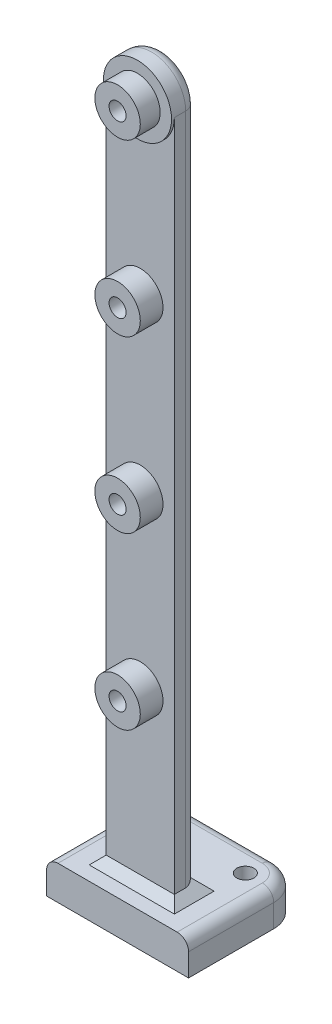
ISO-10303-21;
HEADER;
FILE_DESCRIPTION(('STEP AP214'),'2;1');
FILE_NAME('part.step','',(''),(''),'','','');
FILE_SCHEMA(('AUTOMOTIVE_DESIGN { 1 0 10303 214 1 1 1 1 }'));
ENDSEC;
DATA;
#1=APPLICATION_CONTEXT('core data for automotive mechanical design processes');
#2=APPLICATION_PROTOCOL_DEFINITION('international standard','automotive_design',2000,#1);
#3=PRODUCT_CONTEXT('',#1,'mechanical');
#4=PRODUCT('Part','Part','',(#3));
#5=PRODUCT_RELATED_PRODUCT_CATEGORY('part','',(#4));
#6=PRODUCT_DEFINITION_FORMATION('','',#4);
#7=PRODUCT_DEFINITION_CONTEXT('part definition',#1,'design');
#8=PRODUCT_DEFINITION('design','',#6,#7);
#9=PRODUCT_DEFINITION_SHAPE('','',#8);
#10=(LENGTH_UNIT() NAMED_UNIT(*) SI_UNIT(.MILLI.,.METRE.));
#11=(NAMED_UNIT(*) PLANE_ANGLE_UNIT() SI_UNIT($,.RADIAN.));
#12=(NAMED_UNIT(*) SI_UNIT($,.STERADIAN.) SOLID_ANGLE_UNIT());
#13=UNCERTAINTY_MEASURE_WITH_UNIT(LENGTH_MEASURE(1.E-05),#10,'distance_accuracy_value','');
#14=(GEOMETRIC_REPRESENTATION_CONTEXT(3) GLOBAL_UNCERTAINTY_ASSIGNED_CONTEXT((#13)) GLOBAL_UNIT_ASSIGNED_CONTEXT((#10,
#11,#12)) REPRESENTATION_CONTEXT('',''));
#15=CARTESIAN_POINT('',(0.,0.,0.));
#16=DIRECTION('',(0.,0.,1.));
#17=DIRECTION('',(1.,0.,0.));
#18=AXIS2_PLACEMENT_3D('',#15,#16,#17);
#19=CARTESIAN_POINT('',(0.,0.,4.));
#20=DIRECTION('',(0.,0.,1.));
#21=DIRECTION('',(1.,0.,0.));
#22=AXIS2_PLACEMENT_3D('',#19,#20,#21);
#23=PLANE('',#22);
#24=DIRECTION('',(0.,-1.,0.));
#25=VECTOR('',#24,1.);
#26=CARTESIAN_POINT('',(-5.99999999999999,0.,4.));
#27=LINE('',#26,#25);
#28=CARTESIAN_POINT('',(-6.00000000000001,60.,4.));
#29=VERTEX_POINT('',#28);
#30=CARTESIAN_POINT('',(-5.99999999999997,-58.5,4.));
#31=VERTEX_POINT('',#30);
#32=EDGE_CURVE('E294',#29,#31,#27,.T.);
#33=ORIENTED_EDGE('',*,*,#32,.T.);
#34=DIRECTION('',(1.,0.,0.));
#35=VECTOR('',#34,1.);
#36=CARTESIAN_POINT('',(5.99999999999999,-58.5,4.));
#37=LINE('',#36,#35);
#38=CARTESIAN_POINT('',(5.99999999999999,-58.5,4.));
#39=VERTEX_POINT('',#38);
#40=EDGE_CURVE('E322',#31,#39,#37,.T.);
#41=ORIENTED_EDGE('',*,*,#40,.T.);
#42=DIRECTION('',(0.,-1.,0.));
#43=VECTOR('',#42,1.);
#44=CARTESIAN_POINT('',(5.99999999999998,0.,4.));
#45=LINE('',#44,#43);
#46=CARTESIAN_POINT('',(5.99999999999996,60.,4.));
#47=VERTEX_POINT('',#46);
#48=EDGE_CURVE('E297',#47,#39,#45,.T.);
#49=ORIENTED_EDGE('',*,*,#48,.F.);
#50=CARTESIAN_POINT('',(0.,60.,4.));
#51=DIRECTION('',(0.,0.,1.));
#52=DIRECTION('',(1.,0.,0.));
#53=AXIS2_PLACEMENT_3D('',#50,#51,#52);
#54=CIRCLE('',#53,5.99999999999998);
#55=EDGE_CURVE('E248',#47,#29,#54,.F.);
#56=ORIENTED_EDGE('',*,*,#55,.T.);
#57=EDGE_LOOP('',(#33,#41,#49,#56));
#58=FACE_BOUND('',#57,.T.);
#59=CARTESIAN_POINT('',(0.,30.,4.));
#60=DIRECTION('',(0.,0.,1.));
#61=DIRECTION('',(1.,0.,0.));
#62=AXIS2_PLACEMENT_3D('',#59,#60,#61);
#63=CIRCLE('',#62,4.);
#64=CARTESIAN_POINT('',(4.,30.,4.));
#65=VERTEX_POINT('',#64);
#66=EDGE_CURVE('E285',#65,#65,#63,.T.);
#67=ORIENTED_EDGE('',*,*,#66,.F.);
#68=EDGE_LOOP('',(#67));
#69=FACE_BOUND('',#68,.T.);
#70=CARTESIAN_POINT('',(0.,0.,4.));
#71=DIRECTION('',(0.,0.,1.));
#72=DIRECTION('',(1.,0.,0.));
#73=AXIS2_PLACEMENT_3D('',#70,#71,#72);
#74=CIRCLE('',#73,4.);
#75=CARTESIAN_POINT('',(3.99999999999999,0.,4.));
#76=VERTEX_POINT('',#75);
#77=EDGE_CURVE('E288',#76,#76,#74,.T.);
#78=ORIENTED_EDGE('',*,*,#77,.F.);
#79=EDGE_LOOP('',(#78));
#80=FACE_BOUND('',#79,.T.);
#81=CARTESIAN_POINT('',(0.,-30.,4.));
#82=DIRECTION('',(0.,0.,1.));
#83=DIRECTION('',(1.,0.,0.));
#84=AXIS2_PLACEMENT_3D('',#81,#82,#83);
#85=CIRCLE('',#84,4.);
#86=CARTESIAN_POINT('',(4.00000000000001,-30.,4.));
#87=VERTEX_POINT('',#86);
#88=EDGE_CURVE('E291',#87,#87,#85,.T.);
#89=ORIENTED_EDGE('',*,*,#88,.F.);
#90=EDGE_LOOP('',(#89));
#91=FACE_BOUND('',#90,.T.);
#92=ADVANCED_FACE('F81',(#58,#69,#80,#91),#23,.T.);
#93=CARTESIAN_POINT('',(-5.99999999999999,0.,4.));
#94=DIRECTION('',(1.,0.,0.));
#95=DIRECTION('',(0.,1.,0.));
#96=AXIS2_PLACEMENT_3D('',#93,#94,#95);
#97=PLANE('',#96);
#98=DIRECTION('',(0.,0.,-1.));
#99=VECTOR('',#98,1.);
#100=CARTESIAN_POINT('',(-6.00000000000001,60.,4.));
#101=LINE('',#100,#99);
#102=CARTESIAN_POINT('',(-6.00000000000001,60.,2.));
#103=VERTEX_POINT('',#102);
#104=EDGE_CURVE('E303',#29,#103,#101,.T.);
#105=ORIENTED_EDGE('',*,*,#104,.T.);
#106=DIRECTION('',(0.,-1.,0.));
#107=VECTOR('',#106,1.);
#108=CARTESIAN_POINT('',(-5.99999999999999,0.,2.));
#109=LINE('',#108,#107);
#110=CARTESIAN_POINT('',(-5.99999999999997,-58.5,2.));
#111=VERTEX_POINT('',#110);
#112=EDGE_CURVE('E327',#103,#111,#109,.T.);
#113=ORIENTED_EDGE('',*,*,#112,.T.);
#114=DIRECTION('',(0.,0.,1.));
#115=VECTOR('',#114,1.);
#116=CARTESIAN_POINT('',(-5.99999999999997,-58.5,4.));
#117=LINE('',#116,#115);
#118=EDGE_CURVE('E320',#111,#31,#117,.T.);
#119=ORIENTED_EDGE('',*,*,#118,.T.);
#120=ORIENTED_EDGE('',*,*,#32,.F.);
#121=EDGE_LOOP('',(#105,#113,#119,#120));
#122=FACE_BOUND('',#121,.T.);
#123=ADVANCED_FACE('F460',(#122),#97,.F.);
#124=CARTESIAN_POINT('',(5.99999999999998,0.,4.));
#125=DIRECTION('',(1.,0.,0.));
#126=DIRECTION('',(0.,1.,0.));
#127=AXIS2_PLACEMENT_3D('',#124,#125,#126);
#128=PLANE('',#127);
#129=DIRECTION('',(0.,0.,-1.));
#130=VECTOR('',#129,1.);
#131=CARTESIAN_POINT('',(5.99999999999999,-58.5,0.));
#132=LINE('',#131,#130);
#133=CARTESIAN_POINT('',(5.99999999999999,-58.5,2.));
#134=VERTEX_POINT('',#133);
#135=EDGE_CURVE('E324',#39,#134,#132,.T.);
#136=ORIENTED_EDGE('',*,*,#135,.T.);
#137=DIRECTION('',(0.,-1.,0.));
#138=VECTOR('',#137,1.);
#139=CARTESIAN_POINT('',(5.99999999999996,60.,2.));
#140=LINE('',#139,#138);
#141=CARTESIAN_POINT('',(5.99999999999996,60.,2.));
#142=VERTEX_POINT('',#141);
#143=EDGE_CURVE('E348',#134,#142,#140,.F.);
#144=ORIENTED_EDGE('',*,*,#143,.T.);
#145=DIRECTION('',(0.,0.,-1.));
#146=VECTOR('',#145,1.);
#147=CARTESIAN_POINT('',(5.99999999999996,60.,4.));
#148=LINE('',#147,#146);
#149=EDGE_CURVE('E300',#47,#142,#148,.T.);
#150=ORIENTED_EDGE('',*,*,#149,.F.);
#151=ORIENTED_EDGE('',*,*,#48,.T.);
#152=EDGE_LOOP('',(#136,#144,#150,#151));
#153=FACE_BOUND('',#152,.T.);
#154=ADVANCED_FACE('F468',(#153),#128,.T.);
#155=CARTESIAN_POINT('',(0.,0.,0.));
#156=DIRECTION('',(0.,0.,1.));
#157=DIRECTION('',(1.,0.,0.));
#158=AXIS2_PLACEMENT_3D('',#155,#156,#157);
#159=PLANE('',#158);
#160=DIRECTION('',(-1.,0.,0.));
#161=VECTOR('',#160,1.);
#162=CARTESIAN_POINT('',(0.,-58.5,0.));
#163=LINE('',#162,#161);
#164=CARTESIAN_POINT('',(3.99999999999999,-58.5,0.));
#165=VERTEX_POINT('',#164);
#166=CARTESIAN_POINT('',(-3.99999999999997,-58.5,0.));
#167=VERTEX_POINT('',#166);
#168=EDGE_CURVE('E306',#165,#167,#163,.T.);
#169=ORIENTED_EDGE('',*,*,#168,.T.);
#170=DIRECTION('',(0.,-1.,0.));
#171=VECTOR('',#170,1.);
#172=CARTESIAN_POINT('',(-3.99999999999999,0.,0.));
#173=LINE('',#172,#171);
#174=CARTESIAN_POINT('',(-4.00000000000001,60.,0.));
#175=VERTEX_POINT('',#174);
#176=EDGE_CURVE('E344',#167,#175,#173,.F.);
#177=ORIENTED_EDGE('',*,*,#176,.T.);
#178=CARTESIAN_POINT('',(0.,60.,0.));
#179=DIRECTION('',(0.,0.,1.));
#180=DIRECTION('',(1.,0.,0.));
#181=AXIS2_PLACEMENT_3D('',#178,#179,#180);
#182=CIRCLE('',#181,3.99999999999998);
#183=CARTESIAN_POINT('',(3.99999999999996,60.,0.));
#184=VERTEX_POINT('',#183);
#185=EDGE_CURVE('E342',#175,#184,#182,.F.);
#186=ORIENTED_EDGE('',*,*,#185,.T.);
#187=DIRECTION('',(0.,-1.,0.));
#188=VECTOR('',#187,1.);
#189=CARTESIAN_POINT('',(3.99999999999999,-58.5,0.));
#190=LINE('',#189,#188);
#191=EDGE_CURVE('E340',#184,#165,#190,.T.);
#192=ORIENTED_EDGE('',*,*,#191,.T.);
#193=EDGE_LOOP('',(#169,#177,#186,#192));
#194=FACE_BOUND('',#193,.T.);
#195=CARTESIAN_POINT('',(0.,30.,0.));
#196=DIRECTION('',(0.,0.,1.));
#197=DIRECTION('',(1.,0.,0.));
#198=AXIS2_PLACEMENT_3D('',#195,#196,#197);
#199=CIRCLE('',#198,1.5);
#200=CARTESIAN_POINT('',(1.5,30.,0.));
#201=VERTEX_POINT('',#200);
#202=EDGE_CURVE('E259',#201,#201,#199,.T.);
#203=ORIENTED_EDGE('',*,*,#202,.T.);
#204=EDGE_LOOP('',(#203));
#205=FACE_BOUND('',#204,.T.);
#206=CARTESIAN_POINT('',(0.,0.,0.));
#207=DIRECTION('',(0.,0.,1.));
#208=DIRECTION('',(1.,0.,0.));
#209=AXIS2_PLACEMENT_3D('',#206,#207,#208);
#210=CIRCLE('',#209,1.5);
#211=CARTESIAN_POINT('',(1.49999999999999,0.,0.));
#212=VERTEX_POINT('',#211);
#213=EDGE_CURVE('E263',#212,#212,#210,.T.);
#214=ORIENTED_EDGE('',*,*,#213,.T.);
#215=EDGE_LOOP('',(#214));
#216=FACE_BOUND('',#215,.T.);
#217=CARTESIAN_POINT('',(0.,-30.,0.));
#218=DIRECTION('',(0.,0.,1.));
#219=DIRECTION('',(1.,0.,0.));
#220=AXIS2_PLACEMENT_3D('',#217,#218,#219);
#221=CIRCLE('',#220,1.5);
#222=CARTESIAN_POINT('',(1.50000000000001,-30.,0.));
#223=VERTEX_POINT('',#222);
#224=EDGE_CURVE('E251',#223,#223,#221,.T.);
#225=ORIENTED_EDGE('',*,*,#224,.T.);
#226=EDGE_LOOP('',(#225));
#227=FACE_BOUND('',#226,.T.);
#228=CARTESIAN_POINT('',(0.,60.,0.));
#229=DIRECTION('',(0.,0.,1.));
#230=DIRECTION('',(1.,0.,0.));
#231=AXIS2_PLACEMENT_3D('',#228,#229,#230);
#232=CIRCLE('',#231,1.5);
#233=CARTESIAN_POINT('',(1.49999999999998,60.,0.));
#234=VERTEX_POINT('',#233);
#235=EDGE_CURVE('E282',#234,#234,#232,.T.);
#236=ORIENTED_EDGE('',*,*,#235,.T.);
#237=EDGE_LOOP('',(#236));
#238=FACE_BOUND('',#237,.T.);
#239=ADVANCED_FACE('F476',(#194,#205,#216,#227,#238),#159,.F.);
#240=CARTESIAN_POINT('',(0.,60.,4.));
#241=DIRECTION('',(0.,0.,-1.));
#242=DIRECTION('',(-1.,0.,0.));
#243=AXIS2_PLACEMENT_3D('',#240,#241,#242);
#244=CYLINDRICAL_SURFACE('',#243,1.5);
#245=ORIENTED_EDGE('',*,*,#235,.F.);
#246=EDGE_LOOP('',(#245));
#247=FACE_BOUND('',#246,.T.);
#248=CARTESIAN_POINT('',(0.,60.,8.));
#249=DIRECTION('',(0.,0.,1.));
#250=DIRECTION('',(1.,0.,0.));
#251=AXIS2_PLACEMENT_3D('',#248,#249,#250);
#252=CIRCLE('',#251,1.5);
#253=CARTESIAN_POINT('',(1.49999999999998,60.,8.));
#254=VERTEX_POINT('',#253);
#255=EDGE_CURVE('E255',#254,#254,#252,.T.);
#256=ORIENTED_EDGE('',*,*,#255,.T.);
#257=EDGE_LOOP('',(#256));
#258=FACE_BOUND('',#257,.T.);
#259=ADVANCED_FACE('F479',(#247,#258),#244,.F.);
#260=CARTESIAN_POINT('',(0.,60.,4.));
#261=DIRECTION('',(0.,0.,-1.));
#262=DIRECTION('',(-1.,0.,0.));
#263=AXIS2_PLACEMENT_3D('',#260,#261,#262);
#264=CYLINDRICAL_SURFACE('',#263,5.99999999999998);
#265=ORIENTED_EDGE('',*,*,#149,.T.);
#266=CARTESIAN_POINT('',(0.,60.,2.));
#267=DIRECTION('',(0.,0.,1.));
#268=DIRECTION('',(1.,0.,0.));
#269=AXIS2_PLACEMENT_3D('',#266,#267,#268);
#270=CIRCLE('',#269,5.99999999999998);
#271=EDGE_CURVE('E346',#142,#103,#270,.T.);
#272=ORIENTED_EDGE('',*,*,#271,.T.);
#273=ORIENTED_EDGE('',*,*,#104,.F.);
#274=ORIENTED_EDGE('',*,*,#55,.F.);
#275=EDGE_LOOP('',(#265,#272,#273,#274));
#276=FACE_BOUND('',#275,.T.);
#277=CARTESIAN_POINT('',(0.,60.,4.5));
#278=DIRECTION('',(0.,0.,1.));
#279=DIRECTION('',(1.,0.,0.));
#280=AXIS2_PLACEMENT_3D('',#277,#278,#279);
#281=CIRCLE('',#280,5.99999999999998);
#282=CARTESIAN_POINT('',(5.99999999999996,60.,4.5));
#283=VERTEX_POINT('',#282);
#284=EDGE_CURVE('E241',#283,#283,#281,.T.);
#285=ORIENTED_EDGE('',*,*,#284,.F.);
#286=EDGE_LOOP('',(#285));
#287=FACE_BOUND('',#286,.T.);
#288=ADVANCED_FACE('F481',(#276,#287),#264,.T.);
#289=CARTESIAN_POINT('',(0.,30.,8.));
#290=DIRECTION('',(0.,0.,-1.));
#291=DIRECTION('',(-1.,0.,0.));
#292=AXIS2_PLACEMENT_3D('',#289,#290,#291);
#293=CYLINDRICAL_SURFACE('',#292,1.5);
#294=CARTESIAN_POINT('',(0.,30.,8.));
#295=DIRECTION('',(0.,0.,1.));
#296=DIRECTION('',(1.,0.,0.));
#297=AXIS2_PLACEMENT_3D('',#294,#295,#296);
#298=CIRCLE('',#297,1.5);
#299=CARTESIAN_POINT('',(1.5,30.,8.));
#300=VERTEX_POINT('',#299);
#301=EDGE_CURVE('E276',#300,#300,#298,.T.);
#302=ORIENTED_EDGE('',*,*,#301,.T.);
#303=EDGE_LOOP('',(#302));
#304=FACE_BOUND('',#303,.T.);
#305=ORIENTED_EDGE('',*,*,#202,.F.);
#306=EDGE_LOOP('',(#305));
#307=FACE_BOUND('',#306,.T.);
#308=ADVANCED_FACE('F474',(#304,#307),#293,.F.);
#309=CARTESIAN_POINT('',(0.,30.,8.));
#310=DIRECTION('',(0.,0.,-1.));
#311=DIRECTION('',(-1.,0.,0.));
#312=AXIS2_PLACEMENT_3D('',#309,#310,#311);
#313=CYLINDRICAL_SURFACE('',#312,4.);
#314=ORIENTED_EDGE('',*,*,#66,.T.);
#315=EDGE_LOOP('',(#314));
#316=FACE_BOUND('',#315,.T.);
#317=CARTESIAN_POINT('',(0.,30.,8.));
#318=DIRECTION('',(0.,0.,1.));
#319=DIRECTION('',(1.,0.,0.));
#320=AXIS2_PLACEMENT_3D('',#317,#318,#319);
#321=CIRCLE('',#320,4.);
#322=CARTESIAN_POINT('',(4.,30.,8.));
#323=VERTEX_POINT('',#322);
#324=EDGE_CURVE('E279',#323,#323,#321,.T.);
#325=ORIENTED_EDGE('',*,*,#324,.F.);
#326=EDGE_LOOP('',(#325));
#327=FACE_BOUND('',#326,.T.);
#328=ADVANCED_FACE('F600',(#316,#327),#313,.T.);
#329=CARTESIAN_POINT('',(0.,0.,8.));
#330=DIRECTION('',(0.,0.,1.));
#331=DIRECTION('',(1.,0.,0.));
#332=AXIS2_PLACEMENT_3D('',#329,#330,#331);
#333=PLANE('',#332);
#334=ORIENTED_EDGE('',*,*,#301,.F.);
#335=EDGE_LOOP('',(#334));
#336=FACE_BOUND('',#335,.T.);
#337=ORIENTED_EDGE('',*,*,#324,.T.);
#338=EDGE_LOOP('',(#337));
#339=FACE_BOUND('',#338,.T.);
#340=ADVANCED_FACE('F575',(#336,#339),#333,.T.);
#341=CARTESIAN_POINT('',(0.,60.,8.));
#342=DIRECTION('',(0.,0.,-1.));
#343=DIRECTION('',(-1.,0.,0.));
#344=AXIS2_PLACEMENT_3D('',#341,#342,#343);
#345=CYLINDRICAL_SURFACE('',#344,4.);
#346=CARTESIAN_POINT('',(0.,60.,4.5));
#347=DIRECTION('',(0.,0.,1.));
#348=DIRECTION('',(1.,0.,0.));
#349=AXIS2_PLACEMENT_3D('',#346,#347,#348);
#350=CIRCLE('',#349,4.);
#351=CARTESIAN_POINT('',(3.99999999999998,60.,4.5));
#352=VERTEX_POINT('',#351);
#353=EDGE_CURVE('E245',#352,#352,#350,.T.);
#354=ORIENTED_EDGE('',*,*,#353,.T.);
#355=EDGE_LOOP('',(#354));
#356=FACE_BOUND('',#355,.T.);
#357=CARTESIAN_POINT('',(0.,60.,8.));
#358=DIRECTION('',(0.,0.,1.));
#359=DIRECTION('',(1.,0.,0.));
#360=AXIS2_PLACEMENT_3D('',#357,#358,#359);
#361=CIRCLE('',#360,4.);
#362=CARTESIAN_POINT('',(3.99999999999998,60.,8.));
#363=VERTEX_POINT('',#362);
#364=EDGE_CURVE('E252',#363,#363,#361,.T.);
#365=ORIENTED_EDGE('',*,*,#364,.F.);
#366=EDGE_LOOP('',(#365));
#367=FACE_BOUND('',#366,.T.);
#368=ADVANCED_FACE('F571',(#356,#367),#345,.T.);
#369=CARTESIAN_POINT('',(0.,0.,8.));
#370=DIRECTION('',(0.,0.,1.));
#371=DIRECTION('',(1.,0.,0.));
#372=AXIS2_PLACEMENT_3D('',#369,#370,#371);
#373=PLANE('',#372);
#374=ORIENTED_EDGE('',*,*,#364,.T.);
#375=EDGE_LOOP('',(#374));
#376=FACE_BOUND('',#375,.T.);
#377=ORIENTED_EDGE('',*,*,#255,.F.);
#378=EDGE_LOOP('',(#377));
#379=FACE_BOUND('',#378,.T.);
#380=ADVANCED_FACE('F567',(#376,#379),#373,.T.);
#381=CARTESIAN_POINT('',(0.,0.,8.));
#382=DIRECTION('',(0.,0.,-1.));
#383=DIRECTION('',(-1.,0.,0.));
#384=AXIS2_PLACEMENT_3D('',#381,#382,#383);
#385=CYLINDRICAL_SURFACE('',#384,1.5);
#386=CARTESIAN_POINT('',(0.,0.,8.));
#387=DIRECTION('',(0.,0.,1.));
#388=DIRECTION('',(1.,0.,0.));
#389=AXIS2_PLACEMENT_3D('',#386,#387,#388);
#390=CIRCLE('',#389,1.5);
#391=CARTESIAN_POINT('',(1.49999999999999,0.,8.));
#392=VERTEX_POINT('',#391);
#393=EDGE_CURVE('E260',#392,#392,#390,.T.);
#394=ORIENTED_EDGE('',*,*,#393,.T.);
#395=EDGE_LOOP('',(#394));
#396=FACE_BOUND('',#395,.T.);
#397=ORIENTED_EDGE('',*,*,#213,.F.);
#398=EDGE_LOOP('',(#397));
#399=FACE_BOUND('',#398,.T.);
#400=ADVANCED_FACE('F570',(#396,#399),#385,.F.);
#401=CARTESIAN_POINT('',(0.,0.,8.));
#402=DIRECTION('',(0.,0.,-1.));
#403=DIRECTION('',(-1.,0.,0.));
#404=AXIS2_PLACEMENT_3D('',#401,#402,#403);
#405=CYLINDRICAL_SURFACE('',#404,4.);
#406=ORIENTED_EDGE('',*,*,#77,.T.);
#407=EDGE_LOOP('',(#406));
#408=FACE_BOUND('',#407,.T.);
#409=CARTESIAN_POINT('',(0.,0.,8.));
#410=DIRECTION('',(0.,0.,1.));
#411=DIRECTION('',(1.,0.,0.));
#412=AXIS2_PLACEMENT_3D('',#409,#410,#411);
#413=CIRCLE('',#412,4.);
#414=CARTESIAN_POINT('',(3.99999999999999,0.,8.));
#415=VERTEX_POINT('',#414);
#416=EDGE_CURVE('E256',#415,#415,#413,.T.);
#417=ORIENTED_EDGE('',*,*,#416,.F.);
#418=EDGE_LOOP('',(#417));
#419=FACE_BOUND('',#418,.T.);
#420=ADVANCED_FACE('F581',(#408,#419),#405,.T.);
#421=CARTESIAN_POINT('',(0.,0.,8.));
#422=DIRECTION('',(0.,0.,1.));
#423=DIRECTION('',(1.,0.,0.));
#424=AXIS2_PLACEMENT_3D('',#421,#422,#423);
#425=PLANE('',#424);
#426=ORIENTED_EDGE('',*,*,#393,.F.);
#427=EDGE_LOOP('',(#426));
#428=FACE_BOUND('',#427,.T.);
#429=ORIENTED_EDGE('',*,*,#416,.T.);
#430=EDGE_LOOP('',(#429));
#431=FACE_BOUND('',#430,.T.);
#432=ADVANCED_FACE('F577',(#428,#431),#425,.T.);
#433=CARTESIAN_POINT('',(0.,-30.,8.));
#434=DIRECTION('',(0.,0.,-1.));
#435=DIRECTION('',(-1.,0.,0.));
#436=AXIS2_PLACEMENT_3D('',#433,#434,#435);
#437=CYLINDRICAL_SURFACE('',#436,1.5);
#438=CARTESIAN_POINT('',(0.,-30.,8.));
#439=DIRECTION('',(0.,0.,1.));
#440=DIRECTION('',(1.,0.,0.));
#441=AXIS2_PLACEMENT_3D('',#438,#439,#440);
#442=CIRCLE('',#441,1.5);
#443=CARTESIAN_POINT('',(1.50000000000001,-30.,8.));
#444=VERTEX_POINT('',#443);
#445=EDGE_CURVE('E269',#444,#444,#442,.T.);
#446=ORIENTED_EDGE('',*,*,#445,.T.);
#447=EDGE_LOOP('',(#446));
#448=FACE_BOUND('',#447,.T.);
#449=ORIENTED_EDGE('',*,*,#224,.F.);
#450=EDGE_LOOP('',(#449));
#451=FACE_BOUND('',#450,.T.);
#452=ADVANCED_FACE('F580',(#448,#451),#437,.F.);
#453=CARTESIAN_POINT('',(0.,-30.,8.));
#454=DIRECTION('',(0.,0.,-1.));
#455=DIRECTION('',(-1.,0.,0.));
#456=AXIS2_PLACEMENT_3D('',#453,#454,#455);
#457=CYLINDRICAL_SURFACE('',#456,4.);
#458=ORIENTED_EDGE('',*,*,#88,.T.);
#459=EDGE_LOOP('',(#458));
#460=FACE_BOUND('',#459,.T.);
#461=CARTESIAN_POINT('',(0.,-30.,8.));
#462=DIRECTION('',(0.,0.,1.));
#463=DIRECTION('',(1.,0.,0.));
#464=AXIS2_PLACEMENT_3D('',#461,#462,#463);
#465=CIRCLE('',#464,4.);
#466=CARTESIAN_POINT('',(4.00000000000001,-30.,8.));
#467=VERTEX_POINT('',#466);
#468=EDGE_CURVE('E268',#467,#467,#465,.T.);
#469=ORIENTED_EDGE('',*,*,#468,.F.);
#470=EDGE_LOOP('',(#469));
#471=FACE_BOUND('',#470,.T.);
#472=ADVANCED_FACE('F591',(#460,#471),#457,.T.);
#473=CARTESIAN_POINT('',(0.,0.,8.));
#474=DIRECTION('',(0.,0.,1.));
#475=DIRECTION('',(1.,0.,0.));
#476=AXIS2_PLACEMENT_3D('',#473,#474,#475);
#477=PLANE('',#476);
#478=ORIENTED_EDGE('',*,*,#445,.F.);
#479=EDGE_LOOP('',(#478));
#480=FACE_BOUND('',#479,.T.);
#481=ORIENTED_EDGE('',*,*,#468,.T.);
#482=EDGE_LOOP('',(#481));
#483=FACE_BOUND('',#482,.T.);
#484=ADVANCED_FACE('F565',(#480,#483),#477,.T.);
#485=CARTESIAN_POINT('',(0.,0.,4.5));
#486=DIRECTION('',(0.,0.,1.));
#487=DIRECTION('',(1.,0.,0.));
#488=AXIS2_PLACEMENT_3D('',#485,#486,#487);
#489=PLANE('',#488);
#490=ORIENTED_EDGE('',*,*,#284,.T.);
#491=EDGE_LOOP('',(#490));
#492=FACE_BOUND('',#491,.T.);
#493=ORIENTED_EDGE('',*,*,#353,.F.);
#494=EDGE_LOOP('',(#493));
#495=FACE_BOUND('',#494,.T.);
#496=ADVANCED_FACE('F563',(#492,#495),#489,.T.);
#497=CARTESIAN_POINT('',(-12.5,-60.,-12.));
#498=DIRECTION('',(-1.,0.,0.));
#499=DIRECTION('',(0.,0.,1.));
#500=AXIS2_PLACEMENT_3D('',#497,#498,#499);
#501=PLANE('',#500);
#502=DIRECTION('',(0.,-1.,0.));
#503=VECTOR('',#502,1.);
#504=CARTESIAN_POINT('',(-12.5,-60.,8.));
#505=LINE('',#504,#503);
#506=CARTESIAN_POINT('',(-12.5,-62.,8.));
#507=VERTEX_POINT('',#506);
#508=CARTESIAN_POINT('',(-12.5,-66.,8.));
#509=VERTEX_POINT('',#508);
#510=EDGE_CURVE('E208',#507,#509,#505,.T.);
#511=ORIENTED_EDGE('',*,*,#510,.F.);
#512=DIRECTION('',(0.,0.,1.));
#513=VECTOR('',#512,1.);
#514=CARTESIAN_POINT('',(-12.5,-62.,-12.));
#515=LINE('',#514,#513);
#516=CARTESIAN_POINT('',(-12.5,-62.,-7.));
#517=VERTEX_POINT('',#516);
#518=EDGE_CURVE('E393',#507,#517,#515,.F.);
#519=ORIENTED_EDGE('',*,*,#518,.T.);
#520=DIRECTION('',(0.,-1.,0.));
#521=VECTOR('',#520,1.);
#522=CARTESIAN_POINT('',(-12.5,-66.,-7.));
#523=LINE('',#522,#521);
#524=CARTESIAN_POINT('',(-12.5,-66.,-7.));
#525=VERTEX_POINT('',#524);
#526=EDGE_CURVE('E225',#517,#525,#523,.T.);
#527=ORIENTED_EDGE('',*,*,#526,.T.);
#528=DIRECTION('',(0.,0.,1.));
#529=VECTOR('',#528,1.);
#530=CARTESIAN_POINT('',(-12.5,-66.,-12.));
#531=LINE('',#530,#529);
#532=EDGE_CURVE('E222',#525,#509,#531,.T.);
#533=ORIENTED_EDGE('',*,*,#532,.T.);
#534=EDGE_LOOP('',(#511,#519,#527,#533));
#535=FACE_BOUND('',#534,.T.);
#536=ADVANCED_FACE('F223',(#535),#501,.T.);
#537=CARTESIAN_POINT('',(-12.5,-60.,-12.));
#538=DIRECTION('',(0.,1.,0.));
#539=DIRECTION('',(0.,0.,1.));
#540=AXIS2_PLACEMENT_3D('',#537,#538,#539);
#541=PLANE('',#540);
#542=CARTESIAN_POINT('',(-7.50000000000001,-60.,-7.));
#543=DIRECTION('',(0.,1.,0.));
#544=DIRECTION('',(0.,0.,1.));
#545=AXIS2_PLACEMENT_3D('',#542,#543,#544);
#546=CIRCLE('',#545,1.5);
#547=CARTESIAN_POINT('',(-7.50000000000001,-60.,-5.5));
#548=VERTEX_POINT('',#547);
#549=EDGE_CURVE('E408',#548,#548,#546,.T.);
#550=ORIENTED_EDGE('',*,*,#549,.F.);
#551=EDGE_LOOP('',(#550));
#552=FACE_BOUND('',#551,.T.);
#553=CARTESIAN_POINT('',(7.49999999999999,-60.,-7.));
#554=DIRECTION('',(0.,1.,0.));
#555=DIRECTION('',(0.,0.,1.));
#556=AXIS2_PLACEMENT_3D('',#553,#554,#555);
#557=CIRCLE('',#556,1.5);
#558=CARTESIAN_POINT('',(7.49999999999999,-60.,-5.5));
#559=VERTEX_POINT('',#558);
#560=EDGE_CURVE('E413',#559,#559,#557,.T.);
#561=ORIENTED_EDGE('',*,*,#560,.F.);
#562=EDGE_LOOP('',(#561));
#563=FACE_BOUND('',#562,.T.);
#564=DIRECTION('',(0.,0.,-1.));
#565=VECTOR('',#564,1.);
#566=CARTESIAN_POINT('',(-7.49999999999993,-60.,-12.));
#567=LINE('',#566,#565);
#568=CARTESIAN_POINT('',(-7.49999999999993,-60.,5.49999999999996));
#569=VERTEX_POINT('',#568);
#570=CARTESIAN_POINT('',(-7.49999999999993,-60.,-1.49999999999996));
#571=VERTEX_POINT('',#570);
#572=EDGE_CURVE('E315',#569,#571,#567,.T.);
#573=ORIENTED_EDGE('',*,*,#572,.T.);
#574=DIRECTION('',(1.,0.,0.));
#575=VECTOR('',#574,1.);
#576=CARTESIAN_POINT('',(-12.5,-60.,-1.49999999999996));
#577=LINE('',#576,#575);
#578=CARTESIAN_POINT('',(7.49999999999995,-60.,-1.49999999999996));
#579=VERTEX_POINT('',#578);
#580=EDGE_CURVE('E317',#571,#579,#577,.T.);
#581=ORIENTED_EDGE('',*,*,#580,.T.);
#582=DIRECTION('',(0.,0.,1.));
#583=VECTOR('',#582,1.);
#584=CARTESIAN_POINT('',(7.49999999999995,-60.,4.));
#585=LINE('',#584,#583);
#586=CARTESIAN_POINT('',(7.49999999999995,-60.,5.49999999999996));
#587=VERTEX_POINT('',#586);
#588=EDGE_CURVE('E311',#579,#587,#585,.T.);
#589=ORIENTED_EDGE('',*,*,#588,.T.);
#590=DIRECTION('',(-1.,0.,0.));
#591=VECTOR('',#590,1.);
#592=CARTESIAN_POINT('',(-5.99999999999997,-60.,5.49999999999996));
#593=LINE('',#592,#591);
#594=EDGE_CURVE('E313',#587,#569,#593,.T.);
#595=ORIENTED_EDGE('',*,*,#594,.T.);
#596=EDGE_LOOP('',(#573,#581,#589,#595));
#597=FACE_BOUND('',#596,.T.);
#598=CARTESIAN_POINT('',(-7.50000000000001,-60.,-7.));
#599=DIRECTION('',(0.,1.,0.));
#600=DIRECTION('',(0.,0.,1.));
#601=AXIS2_PLACEMENT_3D('',#598,#599,#600);
#602=CIRCLE('',#601,3.);
#603=CARTESIAN_POINT('',(-7.50000000000001,-60.,-10.));
#604=VERTEX_POINT('',#603);
#605=CARTESIAN_POINT('',(-10.5,-60.,-7.));
#606=VERTEX_POINT('',#605);
#607=EDGE_CURVE('E383',#604,#606,#602,.T.);
#608=ORIENTED_EDGE('',*,*,#607,.T.);
#609=DIRECTION('',(0.,0.,1.));
#610=VECTOR('',#609,1.);
#611=CARTESIAN_POINT('',(-10.5,-60.,-12.));
#612=LINE('',#611,#610);
#613=CARTESIAN_POINT('',(-10.5,-60.,8.));
#614=VERTEX_POINT('',#613);
#615=EDGE_CURVE('E386',#606,#614,#612,.T.);
#616=ORIENTED_EDGE('',*,*,#615,.T.);
#617=DIRECTION('',(-1.,0.,0.));
#618=VECTOR('',#617,1.);
#619=CARTESIAN_POINT('',(-12.5,-60.,8.));
#620=LINE('',#619,#618);
#621=CARTESIAN_POINT('',(10.5,-60.,8.));
#622=VERTEX_POINT('',#621);
#623=EDGE_CURVE('E236',#622,#614,#620,.T.);
#624=ORIENTED_EDGE('',*,*,#623,.F.);
#625=DIRECTION('',(0.,0.,1.));
#626=VECTOR('',#625,1.);
#627=CARTESIAN_POINT('',(10.5,-60.,-12.));
#628=LINE('',#627,#626);
#629=CARTESIAN_POINT('',(10.5,-60.,-7.));
#630=VERTEX_POINT('',#629);
#631=EDGE_CURVE('E377',#622,#630,#628,.F.);
#632=ORIENTED_EDGE('',*,*,#631,.T.);
#633=CARTESIAN_POINT('',(7.49999999999999,-60.,-7.));
#634=DIRECTION('',(0.,1.,0.));
#635=DIRECTION('',(0.,0.,1.));
#636=AXIS2_PLACEMENT_3D('',#633,#634,#635);
#637=CIRCLE('',#636,3.);
#638=CARTESIAN_POINT('',(7.49999999999999,-60.,-10.));
#639=VERTEX_POINT('',#638);
#640=EDGE_CURVE('E379',#630,#639,#637,.T.);
#641=ORIENTED_EDGE('',*,*,#640,.T.);
#642=DIRECTION('',(-1.,0.,0.));
#643=VECTOR('',#642,1.);
#644=CARTESIAN_POINT('',(-7.50000000000001,-60.,-10.));
#645=LINE('',#644,#643);
#646=EDGE_CURVE('E381',#639,#604,#645,.T.);
#647=ORIENTED_EDGE('',*,*,#646,.T.);
#648=EDGE_LOOP('',(#608,#616,#624,#632,#641,#647));
#649=FACE_BOUND('',#648,.T.);
#650=ADVANCED_FACE('F437',(#552,#563,#597,#649),#541,.T.);
#651=CARTESIAN_POINT('',(12.5,-60.,-12.));
#652=DIRECTION('',(1.,0.,0.));
#653=DIRECTION('',(0.,0.,-1.));
#654=AXIS2_PLACEMENT_3D('',#651,#652,#653);
#655=PLANE('',#654);
#656=DIRECTION('',(0.,1.,0.));
#657=VECTOR('',#656,1.);
#658=CARTESIAN_POINT('',(12.5,-60.,-7.));
#659=LINE('',#658,#657);
#660=CARTESIAN_POINT('',(12.5,-66.,-7.));
#661=VERTEX_POINT('',#660);
#662=CARTESIAN_POINT('',(12.5,-62.,-7.));
#663=VERTEX_POINT('',#662);
#664=EDGE_CURVE('E375',#661,#663,#659,.T.);
#665=ORIENTED_EDGE('',*,*,#664,.T.);
#666=DIRECTION('',(0.,0.,1.));
#667=VECTOR('',#666,1.);
#668=CARTESIAN_POINT('',(12.5,-62.,-12.));
#669=LINE('',#668,#667);
#670=CARTESIAN_POINT('',(12.5,-62.,8.));
#671=VERTEX_POINT('',#670);
#672=EDGE_CURVE('E12',#663,#671,#669,.T.);
#673=ORIENTED_EDGE('',*,*,#672,.T.);
#674=DIRECTION('',(0.,1.,0.));
#675=VECTOR('',#674,1.);
#676=CARTESIAN_POINT('',(12.5,-60.,8.));
#677=LINE('',#676,#675);
#678=CARTESIAN_POINT('',(12.5,-66.,8.));
#679=VERTEX_POINT('',#678);
#680=EDGE_CURVE('E234',#679,#671,#677,.T.);
#681=ORIENTED_EDGE('',*,*,#680,.F.);
#682=DIRECTION('',(0.,0.,1.));
#683=VECTOR('',#682,1.);
#684=CARTESIAN_POINT('',(12.5,-66.,-12.));
#685=LINE('',#684,#683);
#686=EDGE_CURVE('E228',#661,#679,#685,.T.);
#687=ORIENTED_EDGE('',*,*,#686,.F.);
#688=EDGE_LOOP('',(#665,#673,#681,#687));
#689=FACE_BOUND('',#688,.T.);
#690=ADVANCED_FACE('F426',(#689),#655,.T.);
#691=CARTESIAN_POINT('',(-12.5,-66.,-12.));
#692=DIRECTION('',(0.,-1.,0.));
#693=DIRECTION('',(0.,0.,-1.));
#694=AXIS2_PLACEMENT_3D('',#691,#692,#693);
#695=PLANE('',#694);
#696=CARTESIAN_POINT('',(-7.50000000000001,-66.,-7.));
#697=DIRECTION('',(0.,-1.,0.));
#698=DIRECTION('',(0.,0.,-1.));
#699=AXIS2_PLACEMENT_3D('',#696,#697,#698);
#700=CIRCLE('',#699,1.5);
#701=CARTESIAN_POINT('',(-7.50000000000001,-66.,-8.5));
#702=VERTEX_POINT('',#701);
#703=EDGE_CURVE('E85',#702,#702,#700,.T.);
#704=ORIENTED_EDGE('',*,*,#703,.F.);
#705=EDGE_LOOP('',(#704));
#706=FACE_BOUND('',#705,.T.);
#707=CARTESIAN_POINT('',(7.49999999999999,-66.,-7.));
#708=DIRECTION('',(0.,-1.,0.));
#709=DIRECTION('',(0.,0.,-1.));
#710=AXIS2_PLACEMENT_3D('',#707,#708,#709);
#711=CIRCLE('',#710,1.5);
#712=CARTESIAN_POINT('',(7.49999999999999,-66.,-8.5));
#713=VERTEX_POINT('',#712);
#714=EDGE_CURVE('E406',#713,#713,#711,.T.);
#715=ORIENTED_EDGE('',*,*,#714,.F.);
#716=EDGE_LOOP('',(#715));
#717=FACE_BOUND('',#716,.T.);
#718=ORIENTED_EDGE('',*,*,#532,.F.);
#719=CARTESIAN_POINT('',(-7.50000000000001,-66.,-7.));
#720=DIRECTION('',(0.,-1.,0.));
#721=DIRECTION('',(0.,0.,-1.));
#722=AXIS2_PLACEMENT_3D('',#719,#720,#721);
#723=CIRCLE('',#722,5.);
#724=CARTESIAN_POINT('',(-7.50000000000001,-66.,-12.));
#725=VERTEX_POINT('',#724);
#726=EDGE_CURVE('E369',#525,#725,#723,.T.);
#727=ORIENTED_EDGE('',*,*,#726,.T.);
#728=DIRECTION('',(1.,0.,0.));
#729=VECTOR('',#728,1.);
#730=CARTESIAN_POINT('',(-12.5,-66.,-12.));
#731=LINE('',#730,#729);
#732=CARTESIAN_POINT('',(7.49999999999999,-66.,-12.));
#733=VERTEX_POINT('',#732);
#734=EDGE_CURVE('E229',#725,#733,#731,.T.);
#735=ORIENTED_EDGE('',*,*,#734,.T.);
#736=CARTESIAN_POINT('',(7.49999999999999,-66.,-7.));
#737=DIRECTION('',(0.,-1.,0.));
#738=DIRECTION('',(0.,0.,-1.));
#739=AXIS2_PLACEMENT_3D('',#736,#737,#738);
#740=CIRCLE('',#739,5.);
#741=EDGE_CURVE('E367',#733,#661,#740,.T.);
#742=ORIENTED_EDGE('',*,*,#741,.T.);
#743=ORIENTED_EDGE('',*,*,#686,.T.);
#744=DIRECTION('',(1.,0.,0.));
#745=VECTOR('',#744,1.);
#746=CARTESIAN_POINT('',(-12.5,-66.,8.));
#747=LINE('',#746,#745);
#748=EDGE_CURVE('E214',#509,#679,#747,.T.);
#749=ORIENTED_EDGE('',*,*,#748,.F.);
#750=EDGE_LOOP('',(#718,#727,#735,#742,#743,#749));
#751=FACE_BOUND('',#750,.T.);
#752=ADVANCED_FACE('F231',(#706,#717,#751),#695,.T.);
#753=CARTESIAN_POINT('',(0.,0.,-12.));
#754=DIRECTION('',(0.,0.,1.));
#755=DIRECTION('',(1.,0.,0.));
#756=AXIS2_PLACEMENT_3D('',#753,#754,#755);
#757=PLANE('',#756);
#758=DIRECTION('',(0.,-1.,0.));
#759=VECTOR('',#758,1.);
#760=CARTESIAN_POINT('',(-7.50000000000001,-60.,-12.));
#761=LINE('',#760,#759);
#762=CARTESIAN_POINT('',(-7.50000000000001,-62.,-12.));
#763=VERTEX_POINT('',#762);
#764=EDGE_CURVE('E373',#725,#763,#761,.F.);
#765=ORIENTED_EDGE('',*,*,#764,.T.);
#766=DIRECTION('',(-1.,0.,0.));
#767=VECTOR('',#766,1.);
#768=CARTESIAN_POINT('',(7.49999999999999,-62.,-12.));
#769=LINE('',#768,#767);
#770=CARTESIAN_POINT('',(7.49999999999999,-62.,-12.));
#771=VERTEX_POINT('',#770);
#772=EDGE_CURVE('E105',#763,#771,#769,.F.);
#773=ORIENTED_EDGE('',*,*,#772,.T.);
#774=DIRECTION('',(0.,1.,0.));
#775=VECTOR('',#774,1.);
#776=CARTESIAN_POINT('',(7.49999999999999,-66.,-12.));
#777=LINE('',#776,#775);
#778=EDGE_CURVE('E371',#771,#733,#777,.F.);
#779=ORIENTED_EDGE('',*,*,#778,.T.);
#780=ORIENTED_EDGE('',*,*,#734,.F.);
#781=EDGE_LOOP('',(#765,#773,#779,#780));
#782=FACE_BOUND('',#781,.T.);
#783=ADVANCED_FACE('F550',(#782),#757,.F.);
#784=CARTESIAN_POINT('',(0.,0.,8.));
#785=DIRECTION('',(0.,0.,1.));
#786=DIRECTION('',(1.,0.,0.));
#787=AXIS2_PLACEMENT_3D('',#784,#785,#786);
#788=PLANE('',#787);
#789=ORIENTED_EDGE('',*,*,#623,.T.);
#790=CARTESIAN_POINT('',(-10.5,-62.,8.));
#791=DIRECTION('',(0.,0.,1.));
#792=DIRECTION('',(1.,0.,0.));
#793=AXIS2_PLACEMENT_3D('',#790,#791,#792);
#794=CIRCLE('',#793,2.);
#795=EDGE_CURVE('E216',#614,#507,#794,.T.);
#796=ORIENTED_EDGE('',*,*,#795,.T.);
#797=ORIENTED_EDGE('',*,*,#510,.T.);
#798=ORIENTED_EDGE('',*,*,#748,.T.);
#799=ORIENTED_EDGE('',*,*,#680,.T.);
#800=CARTESIAN_POINT('',(10.5,-62.,8.));
#801=DIRECTION('',(0.,0.,1.));
#802=DIRECTION('',(1.,0.,0.));
#803=AXIS2_PLACEMENT_3D('',#800,#801,#802);
#804=CIRCLE('',#803,2.);
#805=EDGE_CURVE('E390',#671,#622,#804,.T.);
#806=ORIENTED_EDGE('',*,*,#805,.T.);
#807=EDGE_LOOP('',(#789,#796,#797,#798,#799,#806));
#808=FACE_BOUND('',#807,.T.);
#809=ADVANCED_FACE('F211',(#808),#788,.T.);
#810=CARTESIAN_POINT('',(-12.5,-60.,5.49999999999996));
#811=DIRECTION('',(0.,0.707106781186544,0.707106781186551));
#812=DIRECTION('',(1.,0.,0.));
#813=AXIS2_PLACEMENT_3D('',#810,#811,#812);
#814=PLANE('',#813);
#815=DIRECTION('',(0.577350269189624,0.577350269189629,-0.577350269189624));
#816=VECTOR('',#815,1.);
#817=CARTESIAN_POINT('',(-9.16666666666661,-61.6666666666667,7.16666666666664));
#818=LINE('',#817,#816);
#819=EDGE_CURVE('E333',#569,#31,#818,.T.);
#820=ORIENTED_EDGE('',*,*,#819,.F.);
#821=ORIENTED_EDGE('',*,*,#594,.F.);
#822=DIRECTION('',(0.577350269189623,-0.57735026918963,0.577350269189624));
#823=VECTOR('',#822,1.);
#824=CARTESIAN_POINT('',(5.99999999999999,-58.5,4.));
#825=LINE('',#824,#823);
#826=EDGE_CURVE('E219',#39,#587,#825,.T.);
#827=ORIENTED_EDGE('',*,*,#826,.F.);
#828=ORIENTED_EDGE('',*,*,#40,.F.);
#829=EDGE_LOOP('',(#820,#821,#827,#828));
#830=FACE_BOUND('',#829,.T.);
#831=ADVANCED_FACE('F513',(#830),#814,.T.);
#832=CARTESIAN_POINT('',(5.99999999999999,-58.5,4.));
#833=DIRECTION('',(0.707106781186551,0.707106781186544,0.));
#834=DIRECTION('',(0.,0.,1.));
#835=AXIS2_PLACEMENT_3D('',#832,#833,#834);
#836=PLANE('',#835);
#837=ORIENTED_EDGE('',*,*,#826,.T.);
#838=ORIENTED_EDGE('',*,*,#588,.F.);
#839=DIRECTION('',(0.577350269189623,-0.57735026918963,-0.577350269189624));
#840=VECTOR('',#839,1.);
#841=CARTESIAN_POINT('',(4.66666666666667,-57.1666666666667,1.33333333333333));
#842=LINE('',#841,#840);
#843=CARTESIAN_POINT('',(5.41421356237309,-57.9142135623731,0.585786437626906));
#844=VERTEX_POINT('',#843);
#845=EDGE_CURVE('E330',#844,#579,#842,.T.);
#846=ORIENTED_EDGE('',*,*,#845,.F.);
#847=CARTESIAN_POINT('',(3.99999999999999,-56.5,2.));
#848=DIRECTION('',(0.707106781186551,0.707106781186544,0.));
#849=DIRECTION('',(-0.707106781186544,0.707106781186551,0.));
#850=AXIS2_PLACEMENT_3D('',#847,#848,#849);
#851=ELLIPSE('',#850,2.82842712474621,2.);
#852=EDGE_CURVE('E358',#844,#134,#851,.F.);
#853=ORIENTED_EDGE('',*,*,#852,.T.);
#854=ORIENTED_EDGE('',*,*,#135,.F.);
#855=EDGE_LOOP('',(#837,#838,#846,#853,#854));
#856=FACE_BOUND('',#855,.T.);
#857=ADVANCED_FACE('F506',(#856),#836,.T.);
#858=CARTESIAN_POINT('',(-7.49999999999993,-60.,-12.));
#859=DIRECTION('',(0.707106781186551,-0.707106781186544,0.));
#860=DIRECTION('',(0.,0.,-1.));
#861=AXIS2_PLACEMENT_3D('',#858,#859,#860);
#862=PLANE('',#861);
#863=ORIENTED_EDGE('',*,*,#819,.T.);
#864=ORIENTED_EDGE('',*,*,#118,.F.);
#865=CARTESIAN_POINT('',(-3.99999999999997,-56.5,2.));
#866=DIRECTION('',(0.707106781186551,-0.707106781186544,0.));
#867=DIRECTION('',(-0.707106781186544,-0.707106781186551,0.));
#868=AXIS2_PLACEMENT_3D('',#865,#866,#867);
#869=ELLIPSE('',#868,2.8284271247462,2.);
#870=CARTESIAN_POINT('',(-5.41421356237306,-57.9142135623731,0.585786437626906));
#871=VERTEX_POINT('',#870);
#872=EDGE_CURVE('E350',#111,#871,#869,.T.);
#873=ORIENTED_EDGE('',*,*,#872,.T.);
#874=DIRECTION('',(-0.577350269189624,-0.577350269189629,-0.577350269189624));
#875=VECTOR('',#874,1.);
#876=CARTESIAN_POINT('',(-10.9999999999999,-63.5,-4.99999999999995));
#877=LINE('',#876,#875);
#878=EDGE_CURVE('E328',#571,#871,#877,.F.);
#879=ORIENTED_EDGE('',*,*,#878,.F.);
#880=ORIENTED_EDGE('',*,*,#572,.F.);
#881=EDGE_LOOP('',(#863,#864,#873,#879,#880));
#882=FACE_BOUND('',#881,.T.);
#883=ADVANCED_FACE('F499',(#882),#862,.F.);
#884=CARTESIAN_POINT('',(0.,-58.5,0.));
#885=DIRECTION('',(0.,-0.707106781186544,0.707106781186551));
#886=DIRECTION('',(-1.,0.,0.));
#887=AXIS2_PLACEMENT_3D('',#884,#885,#886);
#888=PLANE('',#887);
#889=ORIENTED_EDGE('',*,*,#845,.T.);
#890=ORIENTED_EDGE('',*,*,#580,.F.);
#891=ORIENTED_EDGE('',*,*,#878,.T.);
#892=CARTESIAN_POINT('',(-3.99999999999997,-56.5,2.));
#893=DIRECTION('',(0.,-0.707106781186544,0.707106781186551));
#894=DIRECTION('',(0.,-0.707106781186551,-0.707106781186544));
#895=AXIS2_PLACEMENT_3D('',#892,#893,#894);
#896=ELLIPSE('',#895,2.8284271247462,2.);
#897=EDGE_CURVE('E353',#871,#167,#896,.T.);
#898=ORIENTED_EDGE('',*,*,#897,.T.);
#899=ORIENTED_EDGE('',*,*,#168,.F.);
#900=CARTESIAN_POINT('',(3.99999999999999,-56.5,2.));
#901=DIRECTION('',(0.,-0.707106781186544,0.707106781186551));
#902=DIRECTION('',(0.,0.707106781186551,0.707106781186544));
#903=AXIS2_PLACEMENT_3D('',#900,#901,#902);
#904=ELLIPSE('',#903,2.8284271247462,2.);
#905=EDGE_CURVE('E355',#165,#844,#904,.T.);
#906=ORIENTED_EDGE('',*,*,#905,.T.);
#907=EDGE_LOOP('',(#889,#890,#891,#898,#899,#906));
#908=FACE_BOUND('',#907,.T.);
#909=ADVANCED_FACE('F492',(#908),#888,.F.);
#910=CARTESIAN_POINT('',(3.99999999999998,0.,2.));
#911=DIRECTION('',(0.,1.,0.));
#912=DIRECTION('',(-1.,0.,0.));
#913=AXIS2_PLACEMENT_3D('',#910,#911,#912);
#914=CYLINDRICAL_SURFACE('',#913,2.);
#915=ORIENTED_EDGE('',*,*,#905,.F.);
#916=ORIENTED_EDGE('',*,*,#191,.F.);
#917=CARTESIAN_POINT('',(3.99999999999996,60.,2.));
#918=DIRECTION('',(0.,1.,0.));
#919=DIRECTION('',(0.,0.,1.));
#920=AXIS2_PLACEMENT_3D('',#917,#918,#919);
#921=CIRCLE('',#920,2.);
#922=EDGE_CURVE('E331',#142,#184,#921,.T.);
#923=ORIENTED_EDGE('',*,*,#922,.F.);
#924=ORIENTED_EDGE('',*,*,#143,.F.);
#925=ORIENTED_EDGE('',*,*,#852,.F.);
#926=EDGE_LOOP('',(#915,#916,#923,#924,#925));
#927=FACE_BOUND('',#926,.T.);
#928=ADVANCED_FACE('F498',(#927),#914,.T.);
#929=CARTESIAN_POINT('',(0.,60.,2.));
#930=DIRECTION('',(0.,0.,1.));
#931=DIRECTION('',(1.,0.,0.));
#932=AXIS2_PLACEMENT_3D('',#929,#930,#931);
#933=TOROIDAL_SURFACE('',#932,3.99999999999998,2.);
#934=ORIENTED_EDGE('',*,*,#922,.T.);
#935=ORIENTED_EDGE('',*,*,#185,.F.);
#936=CARTESIAN_POINT('',(-4.00000000000001,60.,2.));
#937=DIRECTION('',(0.,-1.,0.));
#938=DIRECTION('',(0.,0.,-1.));
#939=AXIS2_PLACEMENT_3D('',#936,#937,#938);
#940=CIRCLE('',#939,2.);
#941=EDGE_CURVE('E360',#103,#175,#940,.T.);
#942=ORIENTED_EDGE('',*,*,#941,.F.);
#943=ORIENTED_EDGE('',*,*,#271,.F.);
#944=EDGE_LOOP('',(#934,#935,#942,#943));
#945=FACE_BOUND('',#944,.T.);
#946=ADVANCED_FACE('F522',(#945),#933,.T.);
#947=CARTESIAN_POINT('',(-3.99999999999999,0.,2.));
#948=DIRECTION('',(0.,-1.,0.));
#949=DIRECTION('',(1.,0.,0.));
#950=AXIS2_PLACEMENT_3D('',#947,#948,#949);
#951=CYLINDRICAL_SURFACE('',#950,2.);
#952=ORIENTED_EDGE('',*,*,#941,.T.);
#953=ORIENTED_EDGE('',*,*,#176,.F.);
#954=ORIENTED_EDGE('',*,*,#897,.F.);
#955=ORIENTED_EDGE('',*,*,#872,.F.);
#956=ORIENTED_EDGE('',*,*,#112,.F.);
#957=EDGE_LOOP('',(#952,#953,#954,#955,#956));
#958=FACE_BOUND('',#957,.T.);
#959=ADVANCED_FACE('F519',(#958),#951,.T.);
#960=CARTESIAN_POINT('',(-7.50000000000001,-60.,-7.));
#961=DIRECTION('',(0.,1.,0.));
#962=DIRECTION('',(0.,0.,1.));
#963=AXIS2_PLACEMENT_3D('',#960,#961,#962);
#964=CYLINDRICAL_SURFACE('',#963,5.);
#965=ORIENTED_EDGE('',*,*,#526,.F.);
#966=CARTESIAN_POINT('',(-7.50000000000001,-62.,-7.));
#967=DIRECTION('',(0.,1.,0.));
#968=DIRECTION('',(0.,0.,1.));
#969=AXIS2_PLACEMENT_3D('',#966,#967,#968);
#970=CIRCLE('',#969,5.);
#971=EDGE_CURVE('E388',#517,#763,#970,.F.);
#972=ORIENTED_EDGE('',*,*,#971,.T.);
#973=ORIENTED_EDGE('',*,*,#764,.F.);
#974=ORIENTED_EDGE('',*,*,#726,.F.);
#975=EDGE_LOOP('',(#965,#972,#973,#974));
#976=FACE_BOUND('',#975,.T.);
#977=ADVANCED_FACE('F446',(#976),#964,.T.);
#978=CARTESIAN_POINT('',(7.49999999999999,-60.,-7.));
#979=DIRECTION('',(0.,-1.,0.));
#980=DIRECTION('',(0.,0.,-1.));
#981=AXIS2_PLACEMENT_3D('',#978,#979,#980);
#982=CYLINDRICAL_SURFACE('',#981,5.);
#983=ORIENTED_EDGE('',*,*,#778,.F.);
#984=CARTESIAN_POINT('',(7.49999999999999,-62.,-7.));
#985=DIRECTION('',(0.,1.,0.));
#986=DIRECTION('',(0.,0.,1.));
#987=AXIS2_PLACEMENT_3D('',#984,#985,#986);
#988=CIRCLE('',#987,5.);
#989=EDGE_CURVE('E90',#771,#663,#988,.F.);
#990=ORIENTED_EDGE('',*,*,#989,.T.);
#991=ORIENTED_EDGE('',*,*,#664,.F.);
#992=ORIENTED_EDGE('',*,*,#741,.F.);
#993=EDGE_LOOP('',(#983,#990,#991,#992));
#994=FACE_BOUND('',#993,.T.);
#995=ADVANCED_FACE('F423',(#994),#982,.T.);
#996=CARTESIAN_POINT('',(10.5,-62.,-12.));
#997=DIRECTION('',(0.,0.,1.));
#998=DIRECTION('',(1.,0.,0.));
#999=AXIS2_PLACEMENT_3D('',#996,#997,#998);
#1000=CYLINDRICAL_SURFACE('',#999,2.);
#1001=ORIENTED_EDGE('',*,*,#805,.F.);
#1002=ORIENTED_EDGE('',*,*,#672,.F.);
#1003=CARTESIAN_POINT('',(10.5,-62.,-7.));
#1004=DIRECTION('',(0.,0.,-1.));
#1005=DIRECTION('',(-1.,0.,0.));
#1006=AXIS2_PLACEMENT_3D('',#1003,#1004,#1005);
#1007=CIRCLE('',#1006,2.);
#1008=EDGE_CURVE('E363',#630,#663,#1007,.T.);
#1009=ORIENTED_EDGE('',*,*,#1008,.F.);
#1010=ORIENTED_EDGE('',*,*,#631,.F.);
#1011=EDGE_LOOP('',(#1001,#1002,#1009,#1010));
#1012=FACE_BOUND('',#1011,.T.);
#1013=ADVANCED_FACE('F83',(#1012),#1000,.T.);
#1014=CARTESIAN_POINT('',(7.49999999999999,-62.,-7.));
#1015=DIRECTION('',(0.,1.,0.));
#1016=DIRECTION('',(0.,0.,1.));
#1017=AXIS2_PLACEMENT_3D('',#1014,#1015,#1016);
#1018=TOROIDAL_SURFACE('',#1017,3.,2.);
#1019=ORIENTED_EDGE('',*,*,#1008,.T.);
#1020=ORIENTED_EDGE('',*,*,#989,.F.);
#1021=CARTESIAN_POINT('',(7.49999999999999,-62.,-10.));
#1022=DIRECTION('',(-1.,0.,0.));
#1023=DIRECTION('',(0.,0.,1.));
#1024=AXIS2_PLACEMENT_3D('',#1021,#1022,#1023);
#1025=CIRCLE('',#1024,2.);
#1026=EDGE_CURVE('E402',#639,#771,#1025,.T.);
#1027=ORIENTED_EDGE('',*,*,#1026,.F.);
#1028=ORIENTED_EDGE('',*,*,#640,.F.);
#1029=EDGE_LOOP('',(#1019,#1020,#1027,#1028));
#1030=FACE_BOUND('',#1029,.T.);
#1031=ADVANCED_FACE('F433',(#1030),#1018,.T.);
#1032=CARTESIAN_POINT('',(-12.5,-62.,-10.));
#1033=DIRECTION('',(1.,0.,0.));
#1034=DIRECTION('',(0.,0.,-1.));
#1035=AXIS2_PLACEMENT_3D('',#1032,#1033,#1034);
#1036=CYLINDRICAL_SURFACE('',#1035,2.);
#1037=ORIENTED_EDGE('',*,*,#1026,.T.);
#1038=ORIENTED_EDGE('',*,*,#772,.F.);
#1039=CARTESIAN_POINT('',(-7.50000000000001,-62.,-10.));
#1040=DIRECTION('',(-1.,0.,0.));
#1041=DIRECTION('',(0.,0.,1.));
#1042=AXIS2_PLACEMENT_3D('',#1039,#1040,#1041);
#1043=CIRCLE('',#1042,2.);
#1044=EDGE_CURVE('E399',#604,#763,#1043,.T.);
#1045=ORIENTED_EDGE('',*,*,#1044,.F.);
#1046=ORIENTED_EDGE('',*,*,#646,.F.);
#1047=EDGE_LOOP('',(#1037,#1038,#1045,#1046));
#1048=FACE_BOUND('',#1047,.T.);
#1049=ADVANCED_FACE('F451',(#1048),#1036,.T.);
#1050=CARTESIAN_POINT('',(-10.5,-62.,-12.));
#1051=DIRECTION('',(0.,0.,1.));
#1052=DIRECTION('',(1.,0.,0.));
#1053=AXIS2_PLACEMENT_3D('',#1050,#1051,#1052);
#1054=CYLINDRICAL_SURFACE('',#1053,2.);
#1055=ORIENTED_EDGE('',*,*,#795,.F.);
#1056=ORIENTED_EDGE('',*,*,#615,.F.);
#1057=CARTESIAN_POINT('',(-10.5,-62.,-7.));
#1058=DIRECTION('',(0.,0.,-1.));
#1059=DIRECTION('',(-1.,0.,0.));
#1060=AXIS2_PLACEMENT_3D('',#1057,#1058,#1059);
#1061=CIRCLE('',#1060,2.);
#1062=EDGE_CURVE('E397',#517,#606,#1061,.T.);
#1063=ORIENTED_EDGE('',*,*,#1062,.F.);
#1064=ORIENTED_EDGE('',*,*,#518,.F.);
#1065=EDGE_LOOP('',(#1055,#1056,#1063,#1064));
#1066=FACE_BOUND('',#1065,.T.);
#1067=ADVANCED_FACE('F442',(#1066),#1054,.T.);
#1068=CARTESIAN_POINT('',(-7.50000000000001,-62.,-7.));
#1069=DIRECTION('',(0.,1.,0.));
#1070=DIRECTION('',(0.,0.,1.));
#1071=AXIS2_PLACEMENT_3D('',#1068,#1069,#1070);
#1072=TOROIDAL_SURFACE('',#1071,3.,2.);
#1073=ORIENTED_EDGE('',*,*,#1044,.T.);
#1074=ORIENTED_EDGE('',*,*,#971,.F.);
#1075=ORIENTED_EDGE('',*,*,#1062,.T.);
#1076=ORIENTED_EDGE('',*,*,#607,.F.);
#1077=EDGE_LOOP('',(#1073,#1074,#1075,#1076));
#1078=FACE_BOUND('',#1077,.T.);
#1079=ADVANCED_FACE('F448',(#1078),#1072,.T.);
#1080=CARTESIAN_POINT('',(7.49999999999999,-80.,-7.));
#1081=DIRECTION('',(0.,1.,0.));
#1082=DIRECTION('',(0.,0.,1.));
#1083=AXIS2_PLACEMENT_3D('',#1080,#1081,#1082);
#1084=CYLINDRICAL_SURFACE('',#1083,1.5);
#1085=ORIENTED_EDGE('',*,*,#714,.T.);
#1086=EDGE_LOOP('',(#1085));
#1087=FACE_BOUND('',#1086,.T.);
#1088=ORIENTED_EDGE('',*,*,#560,.T.);
#1089=EDGE_LOOP('',(#1088));
#1090=FACE_BOUND('',#1089,.T.);
#1091=ADVANCED_FACE('F535',(#1087,#1090),#1084,.F.);
#1092=CARTESIAN_POINT('',(-7.50000000000001,-80.,-7.));
#1093=DIRECTION('',(0.,1.,0.));
#1094=DIRECTION('',(0.,0.,1.));
#1095=AXIS2_PLACEMENT_3D('',#1092,#1093,#1094);
#1096=CYLINDRICAL_SURFACE('',#1095,1.5);
#1097=ORIENTED_EDGE('',*,*,#703,.T.);
#1098=EDGE_LOOP('',(#1097));
#1099=FACE_BOUND('',#1098,.T.);
#1100=ORIENTED_EDGE('',*,*,#549,.T.);
#1101=EDGE_LOOP('',(#1100));
#1102=FACE_BOUND('',#1101,.T.);
#1103=ADVANCED_FACE('F540',(#1099,#1102),#1096,.F.);
#1104=CLOSED_SHELL('',(#92,#123,#154,#239,#259,#288,#308,#328,#340,#368,#380,#400,#420,#432,
#452,#472,#484,#496,#536,#650,#690,#752,#783,#809,#831,#857,#883,#909,#928,#946,#959,#977,#995,
#1013,#1031,#1049,#1067,#1079,#1091,#1103));
#1105=MANIFOLD_SOLID_BREP('B2',#1104);
#1106=ADVANCED_BREP_SHAPE_REPRESENTATION('',(#18,#1105),#14);
#1107=SHAPE_DEFINITION_REPRESENTATION(#9,#1106);
ENDSEC;
END-ISO-10303-21;
